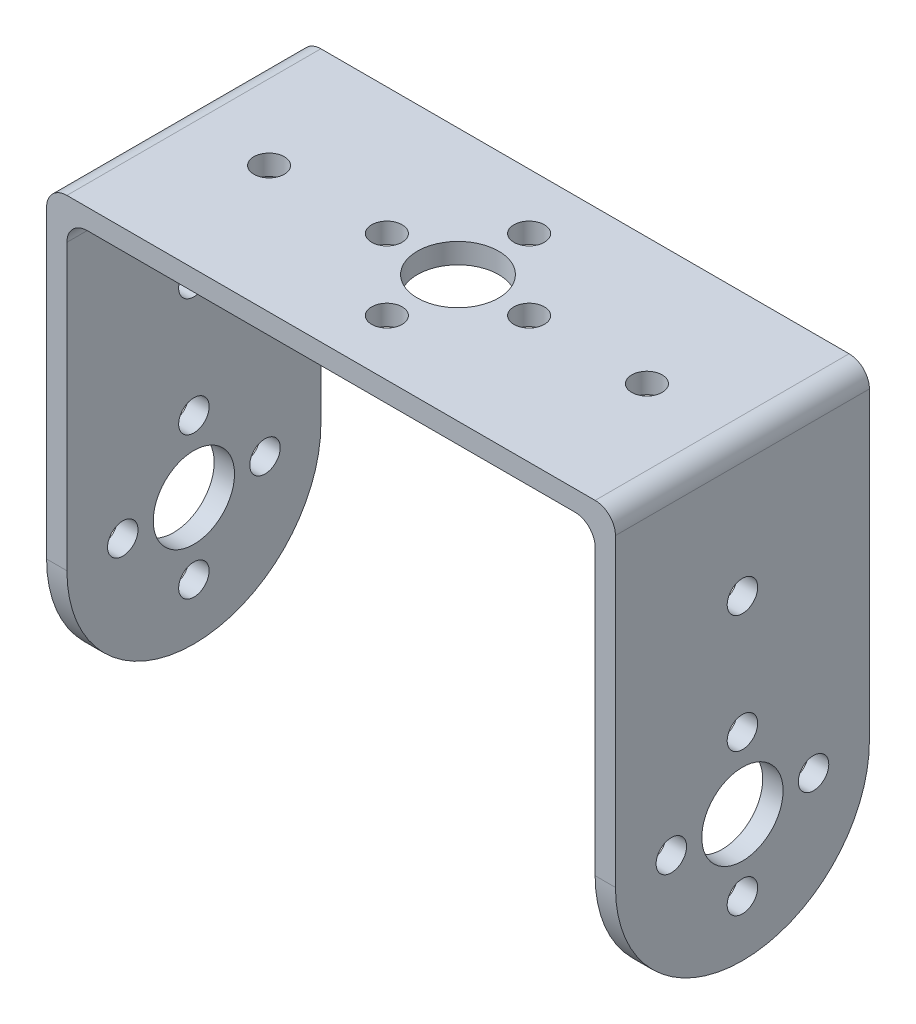
ISO-10303-21;
HEADER;
FILE_DESCRIPTION(('STEP AP214'),'2;1');
FILE_NAME('part.step','',(''),(''),'','','');
FILE_SCHEMA(('AUTOMOTIVE_DESIGN { 1 0 10303 214 1 1 1 1 }'));
ENDSEC;
DATA;
#1=APPLICATION_CONTEXT('core data for automotive mechanical design processes');
#2=APPLICATION_PROTOCOL_DEFINITION('international standard','automotive_design',2000,#1);
#3=PRODUCT_CONTEXT('',#1,'mechanical');
#4=PRODUCT('Part','Part','',(#3));
#5=PRODUCT_RELATED_PRODUCT_CATEGORY('part','',(#4));
#6=PRODUCT_DEFINITION_FORMATION('','',#4);
#7=PRODUCT_DEFINITION_CONTEXT('part definition',#1,'design');
#8=PRODUCT_DEFINITION('design','',#6,#7);
#9=PRODUCT_DEFINITION_SHAPE('','',#8);
#10=(LENGTH_UNIT() NAMED_UNIT(*) SI_UNIT(.MILLI.,.METRE.));
#11=(NAMED_UNIT(*) PLANE_ANGLE_UNIT() SI_UNIT($,.RADIAN.));
#12=(NAMED_UNIT(*) SI_UNIT($,.STERADIAN.) SOLID_ANGLE_UNIT());
#13=UNCERTAINTY_MEASURE_WITH_UNIT(LENGTH_MEASURE(1.E-05),#10,'distance_accuracy_value','');
#14=(GEOMETRIC_REPRESENTATION_CONTEXT(3) GLOBAL_UNCERTAINTY_ASSIGNED_CONTEXT((#13)) GLOBAL_UNIT_ASSIGNED_CONTEXT((#10,
#11,#12)) REPRESENTATION_CONTEXT('',''));
#15=CARTESIAN_POINT('',(0.,0.,0.));
#16=DIRECTION('',(0.,0.,1.));
#17=DIRECTION('',(1.,0.,0.));
#18=AXIS2_PLACEMENT_3D('',#15,#16,#17);
#19=CARTESIAN_POINT('',(0.,2.,0.));
#20=DIRECTION('',(0.,-1.,0.));
#21=DIRECTION('',(0.,0.,-1.));
#22=AXIS2_PLACEMENT_3D('',#19,#20,#21);
#23=PLANE('',#22);
#24=DIRECTION('',(-1.,0.,0.));
#25=VECTOR('',#24,1.);
#26=CARTESIAN_POINT('',(-52.,2.,-25.));
#27=LINE('',#26,#25);
#28=CARTESIAN_POINT('',(0.,2.,-25.));
#29=VERTEX_POINT('',#28);
#30=CARTESIAN_POINT('',(-52.,2.,-25.));
#31=VERTEX_POINT('',#30);
#32=EDGE_CURVE('E168',#29,#31,#27,.T.);
#33=ORIENTED_EDGE('',*,*,#32,.T.);
#34=DIRECTION('',(0.,0.,1.));
#35=VECTOR('',#34,1.);
#36=CARTESIAN_POINT('',(-52.,2.,0.));
#37=LINE('',#36,#35);
#38=CARTESIAN_POINT('',(-52.,2.,0.));
#39=VERTEX_POINT('',#38);
#40=EDGE_CURVE('E209',#31,#39,#37,.T.);
#41=ORIENTED_EDGE('',*,*,#40,.T.);
#42=DIRECTION('',(1.,0.,0.));
#43=VECTOR('',#42,1.);
#44=CARTESIAN_POINT('',(0.,2.,0.));
#45=LINE('',#44,#43);
#46=CARTESIAN_POINT('',(0.,2.,0.));
#47=VERTEX_POINT('',#46);
#48=EDGE_CURVE('E164',#39,#47,#45,.T.);
#49=ORIENTED_EDGE('',*,*,#48,.T.);
#50=DIRECTION('',(0.,0.,-1.));
#51=VECTOR('',#50,1.);
#52=CARTESIAN_POINT('',(0.,2.,-25.));
#53=LINE('',#52,#51);
#54=EDGE_CURVE('E206',#47,#29,#53,.T.);
#55=ORIENTED_EDGE('',*,*,#54,.T.);
#56=EDGE_LOOP('',(#33,#41,#49,#55));
#57=FACE_BOUND('',#56,.T.);
#58=CARTESIAN_POINT('',(-7.40000000000001,2.,-12.5));
#59=DIRECTION('',(0.,1.,0.));
#60=DIRECTION('',(0.,0.,1.));
#61=AXIS2_PLACEMENT_3D('',#58,#59,#60);
#62=CIRCLE('',#61,1.5);
#63=CARTESIAN_POINT('',(-7.40000000000001,2.,-11.));
#64=VERTEX_POINT('',#63);
#65=EDGE_CURVE('E291',#64,#64,#62,.T.);
#66=ORIENTED_EDGE('',*,*,#65,.F.);
#67=EDGE_LOOP('',(#66));
#68=FACE_BOUND('',#67,.T.);
#69=CARTESIAN_POINT('',(-26.,2.,-12.5));
#70=DIRECTION('',(0.,1.,0.));
#71=DIRECTION('',(0.,0.,1.));
#72=AXIS2_PLACEMENT_3D('',#69,#70,#71);
#73=CIRCLE('',#72,4.);
#74=CARTESIAN_POINT('',(-26.,2.,-8.5));
#75=VERTEX_POINT('',#74);
#76=EDGE_CURVE('E285',#75,#75,#73,.T.);
#77=ORIENTED_EDGE('',*,*,#76,.F.);
#78=EDGE_LOOP('',(#77));
#79=FACE_BOUND('',#78,.T.);
#80=CARTESIAN_POINT('',(-26.,2.,-5.5));
#81=DIRECTION('',(0.,1.,0.));
#82=DIRECTION('',(0.,0.,1.));
#83=AXIS2_PLACEMENT_3D('',#80,#81,#82);
#84=CIRCLE('',#83,1.5);
#85=CARTESIAN_POINT('',(-26.,2.,-4.));
#86=VERTEX_POINT('',#85);
#87=EDGE_CURVE('E279',#86,#86,#84,.T.);
#88=ORIENTED_EDGE('',*,*,#87,.F.);
#89=EDGE_LOOP('',(#88));
#90=FACE_BOUND('',#89,.T.);
#91=CARTESIAN_POINT('',(-44.6,2.,-12.5));
#92=DIRECTION('',(0.,1.,0.));
#93=DIRECTION('',(0.,0.,1.));
#94=AXIS2_PLACEMENT_3D('',#91,#92,#93);
#95=CIRCLE('',#94,1.5);
#96=CARTESIAN_POINT('',(-44.6,2.,-11.));
#97=VERTEX_POINT('',#96);
#98=EDGE_CURVE('E273',#97,#97,#95,.T.);
#99=ORIENTED_EDGE('',*,*,#98,.F.);
#100=EDGE_LOOP('',(#99));
#101=FACE_BOUND('',#100,.T.);
#102=CARTESIAN_POINT('',(-33.,2.,-12.5));
#103=DIRECTION('',(0.,1.,0.));
#104=DIRECTION('',(0.,0.,1.));
#105=AXIS2_PLACEMENT_3D('',#102,#103,#104);
#106=CIRCLE('',#105,1.5);
#107=CARTESIAN_POINT('',(-33.,2.,-11.));
#108=VERTEX_POINT('',#107);
#109=EDGE_CURVE('E267',#108,#108,#106,.T.);
#110=ORIENTED_EDGE('',*,*,#109,.F.);
#111=EDGE_LOOP('',(#110));
#112=FACE_BOUND('',#111,.T.);
#113=CARTESIAN_POINT('',(-25.9999999999999,2.,-19.5));
#114=DIRECTION('',(0.,1.,0.));
#115=DIRECTION('',(0.,0.,1.));
#116=AXIS2_PLACEMENT_3D('',#113,#114,#115);
#117=CIRCLE('',#116,1.5);
#118=CARTESIAN_POINT('',(-25.9999999999999,2.,-18.));
#119=VERTEX_POINT('',#118);
#120=EDGE_CURVE('E261',#119,#119,#117,.T.);
#121=ORIENTED_EDGE('',*,*,#120,.F.);
#122=EDGE_LOOP('',(#121));
#123=FACE_BOUND('',#122,.T.);
#124=CARTESIAN_POINT('',(-19.,2.,-12.4999999999999));
#125=DIRECTION('',(0.,1.,0.));
#126=DIRECTION('',(0.,0.,1.));
#127=AXIS2_PLACEMENT_3D('',#124,#125,#126);
#128=CIRCLE('',#127,1.5);
#129=CARTESIAN_POINT('',(-19.,2.,-10.9999999999999));
#130=VERTEX_POINT('',#129);
#131=EDGE_CURVE('E255',#130,#130,#128,.T.);
#132=ORIENTED_EDGE('',*,*,#131,.F.);
#133=EDGE_LOOP('',(#132));
#134=FACE_BOUND('',#133,.T.);
#135=ADVANCED_FACE('F35',(#57,#68,#79,#90,#101,#112,#123,#134),#23,.F.);
#136=CARTESIAN_POINT('',(0.,0.,0.));
#137=DIRECTION('',(0.,-1.,0.));
#138=DIRECTION('',(0.,0.,-1.));
#139=AXIS2_PLACEMENT_3D('',#136,#137,#138);
#140=PLANE('',#139);
#141=CARTESIAN_POINT('',(-25.9999999999999,0.,-19.5));
#142=DIRECTION('',(0.,1.,0.));
#143=DIRECTION('',(0.,0.,1.));
#144=AXIS2_PLACEMENT_3D('',#141,#142,#143);
#145=CIRCLE('',#144,1.5);
#146=CARTESIAN_POINT('',(-25.9999999999999,0.,-18.));
#147=VERTEX_POINT('',#146);
#148=EDGE_CURVE('E258',#147,#147,#145,.T.);
#149=ORIENTED_EDGE('',*,*,#148,.T.);
#150=EDGE_LOOP('',(#149));
#151=FACE_BOUND('',#150,.T.);
#152=CARTESIAN_POINT('',(-44.6,0.,-12.5));
#153=DIRECTION('',(0.,1.,0.));
#154=DIRECTION('',(0.,0.,1.));
#155=AXIS2_PLACEMENT_3D('',#152,#153,#154);
#156=CIRCLE('',#155,1.5);
#157=CARTESIAN_POINT('',(-44.6,0.,-11.));
#158=VERTEX_POINT('',#157);
#159=EDGE_CURVE('E270',#158,#158,#156,.T.);
#160=ORIENTED_EDGE('',*,*,#159,.T.);
#161=EDGE_LOOP('',(#160));
#162=FACE_BOUND('',#161,.T.);
#163=CARTESIAN_POINT('',(-26.,0.,-12.5));
#164=DIRECTION('',(0.,1.,0.));
#165=DIRECTION('',(0.,0.,1.));
#166=AXIS2_PLACEMENT_3D('',#163,#164,#165);
#167=CIRCLE('',#166,4.);
#168=CARTESIAN_POINT('',(-26.,0.,-8.5));
#169=VERTEX_POINT('',#168);
#170=EDGE_CURVE('E282',#169,#169,#167,.T.);
#171=ORIENTED_EDGE('',*,*,#170,.T.);
#172=EDGE_LOOP('',(#171));
#173=FACE_BOUND('',#172,.T.);
#174=DIRECTION('',(-1.,0.,0.));
#175=VECTOR('',#174,1.);
#176=CARTESIAN_POINT('',(-52.,0.,-25.));
#177=LINE('',#176,#175);
#178=CARTESIAN_POINT('',(-2.00000000000002,0.,-25.));
#179=VERTEX_POINT('',#178);
#180=CARTESIAN_POINT('',(-50.,0.,-25.));
#181=VERTEX_POINT('',#180);
#182=EDGE_CURVE('E240',#179,#181,#177,.T.);
#183=ORIENTED_EDGE('',*,*,#182,.F.);
#184=DIRECTION('',(0.,0.,-1.));
#185=VECTOR('',#184,1.);
#186=CARTESIAN_POINT('',(-2.,0.,0.));
#187=LINE('',#186,#185);
#188=CARTESIAN_POINT('',(-2.,0.,0.));
#189=VERTEX_POINT('',#188);
#190=EDGE_CURVE('E202',#179,#189,#187,.F.);
#191=ORIENTED_EDGE('',*,*,#190,.T.);
#192=DIRECTION('',(1.,0.,0.));
#193=VECTOR('',#192,1.);
#194=CARTESIAN_POINT('',(0.,0.,0.));
#195=LINE('',#194,#193);
#196=CARTESIAN_POINT('',(-50.,0.,0.));
#197=VERTEX_POINT('',#196);
#198=EDGE_CURVE('E171',#197,#189,#195,.T.);
#199=ORIENTED_EDGE('',*,*,#198,.F.);
#200=DIRECTION('',(0.,0.,1.));
#201=VECTOR('',#200,1.);
#202=CARTESIAN_POINT('',(-50.,0.,-25.));
#203=LINE('',#202,#201);
#204=EDGE_CURVE('E200',#197,#181,#203,.F.);
#205=ORIENTED_EDGE('',*,*,#204,.T.);
#206=EDGE_LOOP('',(#183,#191,#199,#205));
#207=FACE_BOUND('',#206,.T.);
#208=CARTESIAN_POINT('',(-7.40000000000001,0.,-12.5));
#209=DIRECTION('',(0.,1.,0.));
#210=DIRECTION('',(0.,0.,1.));
#211=AXIS2_PLACEMENT_3D('',#208,#209,#210);
#212=CIRCLE('',#211,1.5);
#213=CARTESIAN_POINT('',(-7.40000000000001,0.,-11.));
#214=VERTEX_POINT('',#213);
#215=EDGE_CURVE('E288',#214,#214,#212,.T.);
#216=ORIENTED_EDGE('',*,*,#215,.T.);
#217=EDGE_LOOP('',(#216));
#218=FACE_BOUND('',#217,.T.);
#219=CARTESIAN_POINT('',(-26.,0.,-5.5));
#220=DIRECTION('',(0.,1.,0.));
#221=DIRECTION('',(0.,0.,1.));
#222=AXIS2_PLACEMENT_3D('',#219,#220,#221);
#223=CIRCLE('',#222,1.5);
#224=CARTESIAN_POINT('',(-26.,0.,-4.));
#225=VERTEX_POINT('',#224);
#226=EDGE_CURVE('E276',#225,#225,#223,.T.);
#227=ORIENTED_EDGE('',*,*,#226,.T.);
#228=EDGE_LOOP('',(#227));
#229=FACE_BOUND('',#228,.T.);
#230=CARTESIAN_POINT('',(-33.,0.,-12.5));
#231=DIRECTION('',(0.,1.,0.));
#232=DIRECTION('',(0.,0.,1.));
#233=AXIS2_PLACEMENT_3D('',#230,#231,#232);
#234=CIRCLE('',#233,1.5);
#235=CARTESIAN_POINT('',(-33.,0.,-11.));
#236=VERTEX_POINT('',#235);
#237=EDGE_CURVE('E264',#236,#236,#234,.T.);
#238=ORIENTED_EDGE('',*,*,#237,.T.);
#239=EDGE_LOOP('',(#238));
#240=FACE_BOUND('',#239,.T.);
#241=CARTESIAN_POINT('',(-19.,0.,-12.4999999999999));
#242=DIRECTION('',(0.,1.,0.));
#243=DIRECTION('',(0.,0.,1.));
#244=AXIS2_PLACEMENT_3D('',#241,#242,#243);
#245=CIRCLE('',#244,1.5);
#246=CARTESIAN_POINT('',(-19.,0.,-10.9999999999999));
#247=VERTEX_POINT('',#246);
#248=EDGE_CURVE('E242',#247,#247,#245,.T.);
#249=ORIENTED_EDGE('',*,*,#248,.T.);
#250=EDGE_LOOP('',(#249));
#251=FACE_BOUND('',#250,.T.);
#252=ADVANCED_FACE('F237',(#151,#162,#173,#207,#218,#229,#240,#251),#140,.T.);
#253=CARTESIAN_POINT('',(-52.,2.,-25.));
#254=DIRECTION('',(0.,0.,1.));
#255=DIRECTION('',(1.,0.,0.));
#256=AXIS2_PLACEMENT_3D('',#253,#254,#255);
#257=PLANE('',#256);
#258=DIRECTION('',(0.,1.,0.));
#259=VECTOR('',#258,1.);
#260=CARTESIAN_POINT('',(-54.,-42.5,-25.));
#261=LINE('',#260,#259);
#262=CARTESIAN_POINT('',(-54.,-30.,-25.));
#263=VERTEX_POINT('',#262);
#264=CARTESIAN_POINT('',(-54.,0.,-25.));
#265=VERTEX_POINT('',#264);
#266=EDGE_CURVE('E158',#263,#265,#261,.T.);
#267=ORIENTED_EDGE('',*,*,#266,.T.);
#268=CARTESIAN_POINT('',(-52.,0.,-25.));
#269=DIRECTION('',(0.,0.,1.));
#270=DIRECTION('',(1.,0.,0.));
#271=AXIS2_PLACEMENT_3D('',#268,#269,#270);
#272=CIRCLE('',#271,2.);
#273=EDGE_CURVE('E218',#265,#31,#272,.F.);
#274=ORIENTED_EDGE('',*,*,#273,.T.);
#275=ORIENTED_EDGE('',*,*,#32,.F.);
#276=CARTESIAN_POINT('',(0.,0.,-25.));
#277=DIRECTION('',(0.,0.,1.));
#278=DIRECTION('',(1.,0.,0.));
#279=AXIS2_PLACEMENT_3D('',#276,#277,#278);
#280=CIRCLE('',#279,2.);
#281=CARTESIAN_POINT('',(2.,0.,-25.));
#282=VERTEX_POINT('',#281);
#283=EDGE_CURVE('E50',#29,#282,#280,.F.);
#284=ORIENTED_EDGE('',*,*,#283,.T.);
#285=DIRECTION('',(0.,1.,0.));
#286=VECTOR('',#285,1.);
#287=CARTESIAN_POINT('',(2.,-42.5,-25.));
#288=LINE('',#287,#286);
#289=CARTESIAN_POINT('',(2.,-30.,-25.));
#290=VERTEX_POINT('',#289);
#291=EDGE_CURVE('E310',#290,#282,#288,.T.);
#292=ORIENTED_EDGE('',*,*,#291,.F.);
#293=DIRECTION('',(-1.,0.,0.));
#294=VECTOR('',#293,1.);
#295=CARTESIAN_POINT('',(-52.,-30.,-25.));
#296=LINE('',#295,#294);
#297=CARTESIAN_POINT('',(0.,-30.,-25.));
#298=VERTEX_POINT('',#297);
#299=EDGE_CURVE('E177',#290,#298,#296,.T.);
#300=ORIENTED_EDGE('',*,*,#299,.T.);
#301=DIRECTION('',(0.,1.,0.));
#302=VECTOR('',#301,1.);
#303=CARTESIAN_POINT('',(0.,-42.5,-25.));
#304=LINE('',#303,#302);
#305=CARTESIAN_POINT('',(0.,-2.,-25.));
#306=VERTEX_POINT('',#305);
#307=EDGE_CURVE('E159',#298,#306,#304,.T.);
#308=ORIENTED_EDGE('',*,*,#307,.T.);
#309=CARTESIAN_POINT('',(-2.,-2.,-25.));
#310=DIRECTION('',(0.,0.,1.));
#311=DIRECTION('',(1.,0.,0.));
#312=AXIS2_PLACEMENT_3D('',#309,#310,#311);
#313=CIRCLE('',#312,2.);
#314=EDGE_CURVE('E222',#306,#179,#313,.T.);
#315=ORIENTED_EDGE('',*,*,#314,.T.);
#316=ORIENTED_EDGE('',*,*,#182,.T.);
#317=CARTESIAN_POINT('',(-50.,-2.,-25.));
#318=DIRECTION('',(0.,0.,1.));
#319=DIRECTION('',(1.,0.,0.));
#320=AXIS2_PLACEMENT_3D('',#317,#318,#319);
#321=CIRCLE('',#320,2.);
#322=CARTESIAN_POINT('',(-52.,-2.,-25.));
#323=VERTEX_POINT('',#322);
#324=EDGE_CURVE('E11',#181,#323,#321,.T.);
#325=ORIENTED_EDGE('',*,*,#324,.T.);
#326=DIRECTION('',(0.,1.,0.));
#327=VECTOR('',#326,1.);
#328=CARTESIAN_POINT('',(-52.,-42.5,-25.));
#329=LINE('',#328,#327);
#330=CARTESIAN_POINT('',(-52.,-30.,-25.));
#331=VERTEX_POINT('',#330);
#332=EDGE_CURVE('E142',#331,#323,#329,.T.);
#333=ORIENTED_EDGE('',*,*,#332,.F.);
#334=DIRECTION('',(-1.,0.,0.));
#335=VECTOR('',#334,1.);
#336=CARTESIAN_POINT('',(-54.,-30.,-25.));
#337=LINE('',#336,#335);
#338=EDGE_CURVE('E155',#331,#263,#337,.T.);
#339=ORIENTED_EDGE('',*,*,#338,.T.);
#340=EDGE_LOOP('',(#267,#274,#275,#284,#292,#300,#308,#315,#316,#325,#333,#339));
#341=FACE_BOUND('',#340,.T.);
#342=ADVANCED_FACE('F154',(#341),#257,.F.);
#343=CARTESIAN_POINT('',(0.,2.,0.));
#344=DIRECTION('',(0.,0.,-1.));
#345=DIRECTION('',(-1.,0.,0.));
#346=AXIS2_PLACEMENT_3D('',#343,#344,#345);
#347=PLANE('',#346);
#348=ORIENTED_EDGE('',*,*,#48,.F.);
#349=CARTESIAN_POINT('',(-52.,0.,0.));
#350=DIRECTION('',(0.,0.,-1.));
#351=DIRECTION('',(-1.,0.,0.));
#352=AXIS2_PLACEMENT_3D('',#349,#350,#351);
#353=CIRCLE('',#352,2.);
#354=CARTESIAN_POINT('',(-54.,0.,0.));
#355=VERTEX_POINT('',#354);
#356=EDGE_CURVE('E214',#39,#355,#353,.F.);
#357=ORIENTED_EDGE('',*,*,#356,.T.);
#358=DIRECTION('',(0.,1.,0.));
#359=VECTOR('',#358,1.);
#360=CARTESIAN_POINT('',(-54.,-42.5,0.));
#361=LINE('',#360,#359);
#362=CARTESIAN_POINT('',(-54.,-30.,0.));
#363=VERTEX_POINT('',#362);
#364=EDGE_CURVE('E243',#363,#355,#361,.T.);
#365=ORIENTED_EDGE('',*,*,#364,.F.);
#366=DIRECTION('',(1.,0.,0.));
#367=VECTOR('',#366,1.);
#368=CARTESIAN_POINT('',(-52.,-30.,0.));
#369=LINE('',#368,#367);
#370=CARTESIAN_POINT('',(-52.,-30.,0.));
#371=VERTEX_POINT('',#370);
#372=EDGE_CURVE('E151',#363,#371,#369,.T.);
#373=ORIENTED_EDGE('',*,*,#372,.T.);
#374=DIRECTION('',(0.,1.,0.));
#375=VECTOR('',#374,1.);
#376=CARTESIAN_POINT('',(-52.,-42.5,0.));
#377=LINE('',#376,#375);
#378=CARTESIAN_POINT('',(-52.,-2.,0.));
#379=VERTEX_POINT('',#378);
#380=EDGE_CURVE('E232',#371,#379,#377,.T.);
#381=ORIENTED_EDGE('',*,*,#380,.T.);
#382=CARTESIAN_POINT('',(-50.,-2.,0.));
#383=DIRECTION('',(0.,0.,-1.));
#384=DIRECTION('',(-1.,0.,0.));
#385=AXIS2_PLACEMENT_3D('',#382,#383,#384);
#386=CIRCLE('',#385,2.);
#387=EDGE_CURVE('E43',#379,#197,#386,.T.);
#388=ORIENTED_EDGE('',*,*,#387,.T.);
#389=ORIENTED_EDGE('',*,*,#198,.T.);
#390=CARTESIAN_POINT('',(-2.,-2.,0.));
#391=DIRECTION('',(0.,0.,-1.));
#392=DIRECTION('',(-1.,0.,0.));
#393=AXIS2_PLACEMENT_3D('',#390,#391,#392);
#394=CIRCLE('',#393,2.);
#395=CARTESIAN_POINT('',(0.,-2.,0.));
#396=VERTEX_POINT('',#395);
#397=EDGE_CURVE('E224',#189,#396,#394,.T.);
#398=ORIENTED_EDGE('',*,*,#397,.T.);
#399=DIRECTION('',(0.,1.,0.));
#400=VECTOR('',#399,1.);
#401=CARTESIAN_POINT('',(0.,-42.5,0.));
#402=LINE('',#401,#400);
#403=CARTESIAN_POINT('',(0.,-30.,0.));
#404=VERTEX_POINT('',#403);
#405=EDGE_CURVE('E180',#404,#396,#402,.T.);
#406=ORIENTED_EDGE('',*,*,#405,.F.);
#407=DIRECTION('',(1.,0.,0.));
#408=VECTOR('',#407,1.);
#409=CARTESIAN_POINT('',(0.,-30.,0.));
#410=LINE('',#409,#408);
#411=CARTESIAN_POINT('',(2.,-30.,0.));
#412=VERTEX_POINT('',#411);
#413=EDGE_CURVE('E192',#404,#412,#410,.T.);
#414=ORIENTED_EDGE('',*,*,#413,.T.);
#415=DIRECTION('',(0.,1.,0.));
#416=VECTOR('',#415,1.);
#417=CARTESIAN_POINT('',(2.,-42.5,0.));
#418=LINE('',#417,#416);
#419=CARTESIAN_POINT('',(2.,0.,0.));
#420=VERTEX_POINT('',#419);
#421=EDGE_CURVE('E308',#412,#420,#418,.T.);
#422=ORIENTED_EDGE('',*,*,#421,.T.);
#423=CARTESIAN_POINT('',(0.,0.,0.));
#424=DIRECTION('',(0.,0.,-1.));
#425=DIRECTION('',(-1.,0.,0.));
#426=AXIS2_PLACEMENT_3D('',#423,#424,#425);
#427=CIRCLE('',#426,2.);
#428=EDGE_CURVE('E212',#420,#47,#427,.F.);
#429=ORIENTED_EDGE('',*,*,#428,.T.);
#430=EDGE_LOOP('',(#348,#357,#365,#373,#381,#388,#389,#398,#406,#414,#422,#429));
#431=FACE_BOUND('',#430,.T.);
#432=ADVANCED_FACE('F230',(#431),#347,.F.);
#433=CARTESIAN_POINT('',(-7.40000000000001,2.,-12.5));
#434=DIRECTION('',(0.,-1.,0.));
#435=DIRECTION('',(0.,0.,-1.));
#436=AXIS2_PLACEMENT_3D('',#433,#434,#435);
#437=CYLINDRICAL_SURFACE('',#436,1.5);
#438=ORIENTED_EDGE('',*,*,#65,.T.);
#439=EDGE_LOOP('',(#438));
#440=FACE_BOUND('',#439,.T.);
#441=ORIENTED_EDGE('',*,*,#215,.F.);
#442=EDGE_LOOP('',(#441));
#443=FACE_BOUND('',#442,.T.);
#444=ADVANCED_FACE('F423',(#440,#443),#437,.F.);
#445=CARTESIAN_POINT('',(-26.,2.,-12.5));
#446=DIRECTION('',(0.,-1.,0.));
#447=DIRECTION('',(0.,0.,-1.));
#448=AXIS2_PLACEMENT_3D('',#445,#446,#447);
#449=CYLINDRICAL_SURFACE('',#448,4.);
#450=ORIENTED_EDGE('',*,*,#76,.T.);
#451=EDGE_LOOP('',(#450));
#452=FACE_BOUND('',#451,.T.);
#453=ORIENTED_EDGE('',*,*,#170,.F.);
#454=EDGE_LOOP('',(#453));
#455=FACE_BOUND('',#454,.T.);
#456=ADVANCED_FACE('F545',(#452,#455),#449,.F.);
#457=CARTESIAN_POINT('',(-26.,2.,-5.5));
#458=DIRECTION('',(0.,-1.,0.));
#459=DIRECTION('',(0.,0.,-1.));
#460=AXIS2_PLACEMENT_3D('',#457,#458,#459);
#461=CYLINDRICAL_SURFACE('',#460,1.5);
#462=ORIENTED_EDGE('',*,*,#87,.T.);
#463=EDGE_LOOP('',(#462));
#464=FACE_BOUND('',#463,.T.);
#465=ORIENTED_EDGE('',*,*,#226,.F.);
#466=EDGE_LOOP('',(#465));
#467=FACE_BOUND('',#466,.T.);
#468=ADVANCED_FACE('F542',(#464,#467),#461,.F.);
#469=CARTESIAN_POINT('',(-44.6,2.,-12.5));
#470=DIRECTION('',(0.,-1.,0.));
#471=DIRECTION('',(0.,0.,-1.));
#472=AXIS2_PLACEMENT_3D('',#469,#470,#471);
#473=CYLINDRICAL_SURFACE('',#472,1.5);
#474=ORIENTED_EDGE('',*,*,#98,.T.);
#475=EDGE_LOOP('',(#474));
#476=FACE_BOUND('',#475,.T.);
#477=ORIENTED_EDGE('',*,*,#159,.F.);
#478=EDGE_LOOP('',(#477));
#479=FACE_BOUND('',#478,.T.);
#480=ADVANCED_FACE('F538',(#476,#479),#473,.F.);
#481=CARTESIAN_POINT('',(-33.,2.,-12.5));
#482=DIRECTION('',(0.,-1.,0.));
#483=DIRECTION('',(0.,0.,-1.));
#484=AXIS2_PLACEMENT_3D('',#481,#482,#483);
#485=CYLINDRICAL_SURFACE('',#484,1.5);
#486=ORIENTED_EDGE('',*,*,#109,.T.);
#487=EDGE_LOOP('',(#486));
#488=FACE_BOUND('',#487,.T.);
#489=ORIENTED_EDGE('',*,*,#237,.F.);
#490=EDGE_LOOP('',(#489));
#491=FACE_BOUND('',#490,.T.);
#492=ADVANCED_FACE('F534',(#488,#491),#485,.F.);
#493=CARTESIAN_POINT('',(-25.9999999999999,2.,-19.5));
#494=DIRECTION('',(0.,-1.,0.));
#495=DIRECTION('',(0.,0.,-1.));
#496=AXIS2_PLACEMENT_3D('',#493,#494,#495);
#497=CYLINDRICAL_SURFACE('',#496,1.5);
#498=ORIENTED_EDGE('',*,*,#120,.T.);
#499=EDGE_LOOP('',(#498));
#500=FACE_BOUND('',#499,.T.);
#501=ORIENTED_EDGE('',*,*,#148,.F.);
#502=EDGE_LOOP('',(#501));
#503=FACE_BOUND('',#502,.T.);
#504=ADVANCED_FACE('F530',(#500,#503),#497,.F.);
#505=CARTESIAN_POINT('',(-19.,2.,-12.4999999999999));
#506=DIRECTION('',(0.,-1.,0.));
#507=DIRECTION('',(0.,0.,-1.));
#508=AXIS2_PLACEMENT_3D('',#505,#506,#507);
#509=CYLINDRICAL_SURFACE('',#508,1.5);
#510=ORIENTED_EDGE('',*,*,#131,.T.);
#511=EDGE_LOOP('',(#510));
#512=FACE_BOUND('',#511,.T.);
#513=ORIENTED_EDGE('',*,*,#248,.F.);
#514=EDGE_LOOP('',(#513));
#515=FACE_BOUND('',#514,.T.);
#516=ADVANCED_FACE('F522',(#512,#515),#509,.F.);
#517=CARTESIAN_POINT('',(-52.,-42.5,-25.));
#518=DIRECTION('',(1.,0.,0.));
#519=DIRECTION('',(0.,0.,-1.));
#520=AXIS2_PLACEMENT_3D('',#517,#518,#519);
#521=PLANE('',#520);
#522=CARTESIAN_POINT('',(-52.,-30.,-5.5000000000001));
#523=DIRECTION('',(1.,0.,0.));
#524=DIRECTION('',(0.,0.,-1.));
#525=AXIS2_PLACEMENT_3D('',#522,#523,#524);
#526=CIRCLE('',#525,1.5);
#527=CARTESIAN_POINT('',(-52.,-30.,-7.0000000000001));
#528=VERTEX_POINT('',#527);
#529=EDGE_CURVE('E197',#528,#528,#526,.T.);
#530=ORIENTED_EDGE('',*,*,#529,.F.);
#531=EDGE_LOOP('',(#530));
#532=FACE_BOUND('',#531,.T.);
#533=CARTESIAN_POINT('',(-52.,-37.,-12.5000000000001));
#534=DIRECTION('',(1.,0.,0.));
#535=DIRECTION('',(0.,0.,-1.));
#536=AXIS2_PLACEMENT_3D('',#533,#534,#535);
#537=CIRCLE('',#536,1.5);
#538=CARTESIAN_POINT('',(-52.,-37.,-14.0000000000001));
#539=VERTEX_POINT('',#538);
#540=EDGE_CURVE('E323',#539,#539,#537,.T.);
#541=ORIENTED_EDGE('',*,*,#540,.F.);
#542=EDGE_LOOP('',(#541));
#543=FACE_BOUND('',#542,.T.);
#544=CARTESIAN_POINT('',(-52.,-29.9999999999999,-19.5000000000001));
#545=DIRECTION('',(1.,0.,0.));
#546=DIRECTION('',(0.,0.,-1.));
#547=AXIS2_PLACEMENT_3D('',#544,#545,#546);
#548=CIRCLE('',#547,1.5);
#549=CARTESIAN_POINT('',(-52.,-29.9999999999999,-21.0000000000001));
#550=VERTEX_POINT('',#549);
#551=EDGE_CURVE('E332',#550,#550,#548,.T.);
#552=ORIENTED_EDGE('',*,*,#551,.F.);
#553=EDGE_LOOP('',(#552));
#554=FACE_BOUND('',#553,.T.);
#555=CARTESIAN_POINT('',(-52.,-11.4,-12.5));
#556=DIRECTION('',(1.,0.,0.));
#557=DIRECTION('',(0.,0.,-1.));
#558=AXIS2_PLACEMENT_3D('',#555,#556,#557);
#559=CIRCLE('',#558,1.5);
#560=CARTESIAN_POINT('',(-52.,-11.4,-14.));
#561=VERTEX_POINT('',#560);
#562=EDGE_CURVE('E341',#561,#561,#559,.T.);
#563=ORIENTED_EDGE('',*,*,#562,.F.);
#564=EDGE_LOOP('',(#563));
#565=FACE_BOUND('',#564,.T.);
#566=CARTESIAN_POINT('',(-52.,-23.,-12.5));
#567=DIRECTION('',(1.,0.,0.));
#568=DIRECTION('',(0.,0.,-1.));
#569=AXIS2_PLACEMENT_3D('',#566,#567,#568);
#570=CIRCLE('',#569,1.5);
#571=CARTESIAN_POINT('',(-52.,-23.,-14.));
#572=VERTEX_POINT('',#571);
#573=EDGE_CURVE('E350',#572,#572,#570,.T.);
#574=ORIENTED_EDGE('',*,*,#573,.F.);
#575=EDGE_LOOP('',(#574));
#576=FACE_BOUND('',#575,.T.);
#577=CARTESIAN_POINT('',(-52.,-30.,-12.5));
#578=DIRECTION('',(1.,0.,0.));
#579=DIRECTION('',(0.,0.,-1.));
#580=AXIS2_PLACEMENT_3D('',#577,#578,#579);
#581=CIRCLE('',#580,4.);
#582=CARTESIAN_POINT('',(-52.,-30.,-16.5));
#583=VERTEX_POINT('',#582);
#584=EDGE_CURVE('E359',#583,#583,#581,.T.);
#585=ORIENTED_EDGE('',*,*,#584,.F.);
#586=EDGE_LOOP('',(#585));
#587=FACE_BOUND('',#586,.T.);
#588=ORIENTED_EDGE('',*,*,#332,.T.);
#589=DIRECTION('',(0.,0.,1.));
#590=VECTOR('',#589,1.);
#591=CARTESIAN_POINT('',(-52.,-2.,0.));
#592=LINE('',#591,#590);
#593=EDGE_CURVE('E204',#323,#379,#592,.T.);
#594=ORIENTED_EDGE('',*,*,#593,.T.);
#595=ORIENTED_EDGE('',*,*,#380,.F.);
#596=CARTESIAN_POINT('',(-52.,-30.,-12.5));
#597=DIRECTION('',(1.,0.,0.));
#598=DIRECTION('',(0.,0.,-1.));
#599=AXIS2_PLACEMENT_3D('',#596,#597,#598);
#600=CIRCLE('',#599,12.5);
#601=CARTESIAN_POINT('',(-52.,-42.5,-12.5));
#602=VERTEX_POINT('',#601);
#603=EDGE_CURVE('E146',#371,#602,#600,.T.);
#604=ORIENTED_EDGE('',*,*,#603,.T.);
#605=CARTESIAN_POINT('',(-52.,-30.,-12.5));
#606=DIRECTION('',(1.,0.,0.));
#607=DIRECTION('',(0.,0.,-1.));
#608=AXIS2_PLACEMENT_3D('',#605,#606,#607);
#609=CIRCLE('',#608,12.5);
#610=EDGE_CURVE('E138',#602,#331,#609,.T.);
#611=ORIENTED_EDGE('',*,*,#610,.T.);
#612=EDGE_LOOP('',(#588,#594,#595,#604,#611));
#613=FACE_BOUND('',#612,.T.);
#614=ADVANCED_FACE('F140',(#532,#543,#554,#565,#576,#587,#613),#521,.T.);
#615=CARTESIAN_POINT('',(-54.,-42.5,0.));
#616=DIRECTION('',(-1.,0.,0.));
#617=DIRECTION('',(0.,0.,1.));
#618=AXIS2_PLACEMENT_3D('',#615,#616,#617);
#619=PLANE('',#618);
#620=CARTESIAN_POINT('',(-54.,-30.,-5.5000000000001));
#621=DIRECTION('',(-1.,0.,0.));
#622=DIRECTION('',(0.,0.,1.));
#623=AXIS2_PLACEMENT_3D('',#620,#621,#622);
#624=CIRCLE('',#623,1.5);
#625=CARTESIAN_POINT('',(-54.,-30.,-4.0000000000001));
#626=VERTEX_POINT('',#625);
#627=EDGE_CURVE('E317',#626,#626,#624,.T.);
#628=ORIENTED_EDGE('',*,*,#627,.F.);
#629=EDGE_LOOP('',(#628));
#630=FACE_BOUND('',#629,.T.);
#631=CARTESIAN_POINT('',(-54.,-37.,-12.5000000000001));
#632=DIRECTION('',(-1.,0.,0.));
#633=DIRECTION('',(0.,0.,1.));
#634=AXIS2_PLACEMENT_3D('',#631,#632,#633);
#635=CIRCLE('',#634,1.5);
#636=CARTESIAN_POINT('',(-54.,-37.,-11.0000000000001));
#637=VERTEX_POINT('',#636);
#638=EDGE_CURVE('E326',#637,#637,#635,.T.);
#639=ORIENTED_EDGE('',*,*,#638,.F.);
#640=EDGE_LOOP('',(#639));
#641=FACE_BOUND('',#640,.T.);
#642=CARTESIAN_POINT('',(-54.,-29.9999999999999,-19.5000000000001));
#643=DIRECTION('',(-1.,0.,0.));
#644=DIRECTION('',(0.,0.,1.));
#645=AXIS2_PLACEMENT_3D('',#642,#643,#644);
#646=CIRCLE('',#645,1.5);
#647=CARTESIAN_POINT('',(-54.,-29.9999999999999,-18.0000000000001));
#648=VERTEX_POINT('',#647);
#649=EDGE_CURVE('E335',#648,#648,#646,.T.);
#650=ORIENTED_EDGE('',*,*,#649,.F.);
#651=EDGE_LOOP('',(#650));
#652=FACE_BOUND('',#651,.T.);
#653=CARTESIAN_POINT('',(-54.,-11.4,-12.5));
#654=DIRECTION('',(-1.,0.,0.));
#655=DIRECTION('',(0.,0.,1.));
#656=AXIS2_PLACEMENT_3D('',#653,#654,#655);
#657=CIRCLE('',#656,1.5);
#658=CARTESIAN_POINT('',(-54.,-11.4,-11.));
#659=VERTEX_POINT('',#658);
#660=EDGE_CURVE('E344',#659,#659,#657,.T.);
#661=ORIENTED_EDGE('',*,*,#660,.F.);
#662=EDGE_LOOP('',(#661));
#663=FACE_BOUND('',#662,.T.);
#664=CARTESIAN_POINT('',(-54.,-23.,-12.5));
#665=DIRECTION('',(-1.,0.,0.));
#666=DIRECTION('',(0.,0.,1.));
#667=AXIS2_PLACEMENT_3D('',#664,#665,#666);
#668=CIRCLE('',#667,1.5);
#669=CARTESIAN_POINT('',(-54.,-23.,-11.));
#670=VERTEX_POINT('',#669);
#671=EDGE_CURVE('E353',#670,#670,#668,.T.);
#672=ORIENTED_EDGE('',*,*,#671,.F.);
#673=EDGE_LOOP('',(#672));
#674=FACE_BOUND('',#673,.T.);
#675=CARTESIAN_POINT('',(-54.,-30.,-12.5));
#676=DIRECTION('',(-1.,0.,0.));
#677=DIRECTION('',(0.,0.,1.));
#678=AXIS2_PLACEMENT_3D('',#675,#676,#677);
#679=CIRCLE('',#678,4.);
#680=CARTESIAN_POINT('',(-54.,-30.,-8.49999999999999));
#681=VERTEX_POINT('',#680);
#682=EDGE_CURVE('E362',#681,#681,#679,.T.);
#683=ORIENTED_EDGE('',*,*,#682,.F.);
#684=EDGE_LOOP('',(#683));
#685=FACE_BOUND('',#684,.T.);
#686=ORIENTED_EDGE('',*,*,#364,.T.);
#687=DIRECTION('',(0.,0.,1.));
#688=VECTOR('',#687,1.);
#689=CARTESIAN_POINT('',(-54.,0.,-25.));
#690=LINE('',#689,#688);
#691=EDGE_CURVE('E58',#355,#265,#690,.F.);
#692=ORIENTED_EDGE('',*,*,#691,.T.);
#693=ORIENTED_EDGE('',*,*,#266,.F.);
#694=CARTESIAN_POINT('',(-54.,-30.,-12.5));
#695=DIRECTION('',(-1.,0.,0.));
#696=DIRECTION('',(0.,0.,1.));
#697=AXIS2_PLACEMENT_3D('',#694,#695,#696);
#698=CIRCLE('',#697,12.5);
#699=CARTESIAN_POINT('',(-54.,-42.5,-12.5));
#700=VERTEX_POINT('',#699);
#701=EDGE_CURVE('E162',#263,#700,#698,.T.);
#702=ORIENTED_EDGE('',*,*,#701,.T.);
#703=CARTESIAN_POINT('',(-54.,-30.,-12.5));
#704=DIRECTION('',(-1.,0.,0.));
#705=DIRECTION('',(0.,0.,1.));
#706=AXIS2_PLACEMENT_3D('',#703,#704,#705);
#707=CIRCLE('',#706,12.5);
#708=EDGE_CURVE('E163',#700,#363,#707,.T.);
#709=ORIENTED_EDGE('',*,*,#708,.T.);
#710=EDGE_LOOP('',(#686,#692,#693,#702,#709));
#711=FACE_BOUND('',#710,.T.);
#712=ADVANCED_FACE('F250',(#630,#641,#652,#663,#674,#685,#711),#619,.T.);
#713=CARTESIAN_POINT('',(0.,-42.5,-25.));
#714=DIRECTION('',(-1.,0.,0.));
#715=DIRECTION('',(0.,0.,1.));
#716=AXIS2_PLACEMENT_3D('',#713,#714,#715);
#717=PLANE('',#716);
#718=CARTESIAN_POINT('',(0.,-30.,-5.5000000000001));
#719=DIRECTION('',(-1.,0.,0.));
#720=DIRECTION('',(0.,0.,1.));
#721=AXIS2_PLACEMENT_3D('',#718,#719,#720);
#722=CIRCLE('',#721,1.5);
#723=CARTESIAN_POINT('',(0.,-30.,-4.0000000000001));
#724=VERTEX_POINT('',#723);
#725=EDGE_CURVE('E320',#724,#724,#722,.T.);
#726=ORIENTED_EDGE('',*,*,#725,.F.);
#727=EDGE_LOOP('',(#726));
#728=FACE_BOUND('',#727,.T.);
#729=CARTESIAN_POINT('',(0.,-37.,-12.5000000000001));
#730=DIRECTION('',(-1.,0.,0.));
#731=DIRECTION('',(0.,0.,1.));
#732=AXIS2_PLACEMENT_3D('',#729,#730,#731);
#733=CIRCLE('',#732,1.5);
#734=CARTESIAN_POINT('',(0.,-37.,-11.0000000000001));
#735=VERTEX_POINT('',#734);
#736=EDGE_CURVE('E329',#735,#735,#733,.T.);
#737=ORIENTED_EDGE('',*,*,#736,.F.);
#738=EDGE_LOOP('',(#737));
#739=FACE_BOUND('',#738,.T.);
#740=CARTESIAN_POINT('',(0.,-29.9999999999999,-19.5000000000001));
#741=DIRECTION('',(-1.,0.,0.));
#742=DIRECTION('',(0.,0.,1.));
#743=AXIS2_PLACEMENT_3D('',#740,#741,#742);
#744=CIRCLE('',#743,1.5);
#745=CARTESIAN_POINT('',(0.,-29.9999999999999,-18.0000000000001));
#746=VERTEX_POINT('',#745);
#747=EDGE_CURVE('E338',#746,#746,#744,.T.);
#748=ORIENTED_EDGE('',*,*,#747,.F.);
#749=EDGE_LOOP('',(#748));
#750=FACE_BOUND('',#749,.T.);
#751=CARTESIAN_POINT('',(0.,-11.4,-12.5));
#752=DIRECTION('',(-1.,0.,0.));
#753=DIRECTION('',(0.,0.,1.));
#754=AXIS2_PLACEMENT_3D('',#751,#752,#753);
#755=CIRCLE('',#754,1.5);
#756=CARTESIAN_POINT('',(0.,-11.4,-11.));
#757=VERTEX_POINT('',#756);
#758=EDGE_CURVE('E347',#757,#757,#755,.T.);
#759=ORIENTED_EDGE('',*,*,#758,.F.);
#760=EDGE_LOOP('',(#759));
#761=FACE_BOUND('',#760,.T.);
#762=CARTESIAN_POINT('',(0.,-23.,-12.5));
#763=DIRECTION('',(-1.,0.,0.));
#764=DIRECTION('',(0.,0.,1.));
#765=AXIS2_PLACEMENT_3D('',#762,#763,#764);
#766=CIRCLE('',#765,1.5);
#767=CARTESIAN_POINT('',(0.,-23.,-11.));
#768=VERTEX_POINT('',#767);
#769=EDGE_CURVE('E356',#768,#768,#766,.T.);
#770=ORIENTED_EDGE('',*,*,#769,.F.);
#771=EDGE_LOOP('',(#770));
#772=FACE_BOUND('',#771,.T.);
#773=CARTESIAN_POINT('',(0.,-30.,-12.5));
#774=DIRECTION('',(-1.,0.,0.));
#775=DIRECTION('',(0.,0.,1.));
#776=AXIS2_PLACEMENT_3D('',#773,#774,#775);
#777=CIRCLE('',#776,4.);
#778=CARTESIAN_POINT('',(0.,-30.,-8.49999999999999));
#779=VERTEX_POINT('',#778);
#780=EDGE_CURVE('E365',#779,#779,#777,.T.);
#781=ORIENTED_EDGE('',*,*,#780,.F.);
#782=EDGE_LOOP('',(#781));
#783=FACE_BOUND('',#782,.T.);
#784=ORIENTED_EDGE('',*,*,#405,.T.);
#785=DIRECTION('',(0.,0.,-1.));
#786=VECTOR('',#785,1.);
#787=CARTESIAN_POINT('',(0.,-2.,-25.));
#788=LINE('',#787,#786);
#789=EDGE_CURVE('E194',#396,#306,#788,.T.);
#790=ORIENTED_EDGE('',*,*,#789,.T.);
#791=ORIENTED_EDGE('',*,*,#307,.F.);
#792=CARTESIAN_POINT('',(0.,-30.,-12.5));
#793=DIRECTION('',(-1.,0.,0.));
#794=DIRECTION('',(0.,0.,1.));
#795=AXIS2_PLACEMENT_3D('',#792,#793,#794);
#796=CIRCLE('',#795,12.5);
#797=CARTESIAN_POINT('',(0.,-42.5,-12.5));
#798=VERTEX_POINT('',#797);
#799=EDGE_CURVE('E186',#298,#798,#796,.T.);
#800=ORIENTED_EDGE('',*,*,#799,.T.);
#801=CARTESIAN_POINT('',(0.,-30.,-12.5));
#802=DIRECTION('',(-1.,0.,0.));
#803=DIRECTION('',(0.,0.,1.));
#804=AXIS2_PLACEMENT_3D('',#801,#802,#803);
#805=CIRCLE('',#804,12.5);
#806=EDGE_CURVE('E184',#798,#404,#805,.T.);
#807=ORIENTED_EDGE('',*,*,#806,.T.);
#808=EDGE_LOOP('',(#784,#790,#791,#800,#807));
#809=FACE_BOUND('',#808,.T.);
#810=ADVANCED_FACE('F305',(#728,#739,#750,#761,#772,#783,#809),#717,.T.);
#811=CARTESIAN_POINT('',(2.,-42.5,0.));
#812=DIRECTION('',(1.,0.,0.));
#813=DIRECTION('',(0.,0.,-1.));
#814=AXIS2_PLACEMENT_3D('',#811,#812,#813);
#815=PLANE('',#814);
#816=CARTESIAN_POINT('',(2.,-30.,-5.5000000000001));
#817=DIRECTION('',(1.,0.,0.));
#818=DIRECTION('',(0.,0.,-1.));
#819=AXIS2_PLACEMENT_3D('',#816,#817,#818);
#820=CIRCLE('',#819,1.5);
#821=CARTESIAN_POINT('',(2.,-30.,-7.0000000000001));
#822=VERTEX_POINT('',#821);
#823=EDGE_CURVE('E372',#822,#822,#820,.T.);
#824=ORIENTED_EDGE('',*,*,#823,.F.);
#825=EDGE_LOOP('',(#824));
#826=FACE_BOUND('',#825,.T.);
#827=CARTESIAN_POINT('',(2.,-37.,-12.5000000000001));
#828=DIRECTION('',(1.,0.,0.));
#829=DIRECTION('',(0.,0.,-1.));
#830=AXIS2_PLACEMENT_3D('',#827,#828,#829);
#831=CIRCLE('',#830,1.5);
#832=CARTESIAN_POINT('',(2.,-37.,-14.0000000000001));
#833=VERTEX_POINT('',#832);
#834=EDGE_CURVE('E375',#833,#833,#831,.T.);
#835=ORIENTED_EDGE('',*,*,#834,.F.);
#836=EDGE_LOOP('',(#835));
#837=FACE_BOUND('',#836,.T.);
#838=CARTESIAN_POINT('',(2.,-29.9999999999999,-19.5000000000001));
#839=DIRECTION('',(1.,0.,0.));
#840=DIRECTION('',(0.,0.,-1.));
#841=AXIS2_PLACEMENT_3D('',#838,#839,#840);
#842=CIRCLE('',#841,1.5);
#843=CARTESIAN_POINT('',(2.,-29.9999999999999,-21.0000000000001));
#844=VERTEX_POINT('',#843);
#845=EDGE_CURVE('E378',#844,#844,#842,.T.);
#846=ORIENTED_EDGE('',*,*,#845,.F.);
#847=EDGE_LOOP('',(#846));
#848=FACE_BOUND('',#847,.T.);
#849=CARTESIAN_POINT('',(2.,-11.4,-12.5));
#850=DIRECTION('',(1.,0.,0.));
#851=DIRECTION('',(0.,0.,-1.));
#852=AXIS2_PLACEMENT_3D('',#849,#850,#851);
#853=CIRCLE('',#852,1.5);
#854=CARTESIAN_POINT('',(2.,-11.4,-14.));
#855=VERTEX_POINT('',#854);
#856=EDGE_CURVE('E381',#855,#855,#853,.T.);
#857=ORIENTED_EDGE('',*,*,#856,.F.);
#858=EDGE_LOOP('',(#857));
#859=FACE_BOUND('',#858,.T.);
#860=CARTESIAN_POINT('',(2.,-23.,-12.5));
#861=DIRECTION('',(1.,0.,0.));
#862=DIRECTION('',(0.,0.,-1.));
#863=AXIS2_PLACEMENT_3D('',#860,#861,#862);
#864=CIRCLE('',#863,1.5);
#865=CARTESIAN_POINT('',(2.,-23.,-14.));
#866=VERTEX_POINT('',#865);
#867=EDGE_CURVE('E371',#866,#866,#864,.T.);
#868=ORIENTED_EDGE('',*,*,#867,.F.);
#869=EDGE_LOOP('',(#868));
#870=FACE_BOUND('',#869,.T.);
#871=CARTESIAN_POINT('',(2.,-30.,-12.5));
#872=DIRECTION('',(1.,0.,0.));
#873=DIRECTION('',(0.,0.,-1.));
#874=AXIS2_PLACEMENT_3D('',#871,#872,#873);
#875=CIRCLE('',#874,4.);
#876=CARTESIAN_POINT('',(2.,-30.,-16.5));
#877=VERTEX_POINT('',#876);
#878=EDGE_CURVE('E368',#877,#877,#875,.T.);
#879=ORIENTED_EDGE('',*,*,#878,.F.);
#880=EDGE_LOOP('',(#879));
#881=FACE_BOUND('',#880,.T.);
#882=ORIENTED_EDGE('',*,*,#291,.T.);
#883=DIRECTION('',(0.,0.,-1.));
#884=VECTOR('',#883,1.);
#885=CARTESIAN_POINT('',(2.,0.,0.));
#886=LINE('',#885,#884);
#887=EDGE_CURVE('E220',#282,#420,#886,.F.);
#888=ORIENTED_EDGE('',*,*,#887,.T.);
#889=ORIENTED_EDGE('',*,*,#421,.F.);
#890=CARTESIAN_POINT('',(2.,-30.,-12.5));
#891=DIRECTION('',(1.,0.,0.));
#892=DIRECTION('',(0.,0.,-1.));
#893=AXIS2_PLACEMENT_3D('',#890,#891,#892);
#894=CIRCLE('',#893,12.5);
#895=CARTESIAN_POINT('',(2.,-42.5,-12.5));
#896=VERTEX_POINT('',#895);
#897=EDGE_CURVE('E188',#412,#896,#894,.T.);
#898=ORIENTED_EDGE('',*,*,#897,.T.);
#899=CARTESIAN_POINT('',(2.,-30.,-12.5));
#900=DIRECTION('',(1.,0.,0.));
#901=DIRECTION('',(0.,0.,-1.));
#902=AXIS2_PLACEMENT_3D('',#899,#900,#901);
#903=CIRCLE('',#902,12.5);
#904=EDGE_CURVE('E190',#896,#290,#903,.T.);
#905=ORIENTED_EDGE('',*,*,#904,.T.);
#906=EDGE_LOOP('',(#882,#888,#889,#898,#905));
#907=FACE_BOUND('',#906,.T.);
#908=ADVANCED_FACE('F389',(#826,#837,#848,#859,#870,#881,#907),#815,.T.);
#909=CARTESIAN_POINT('',(0.,-30.,-12.5));
#910=DIRECTION('',(-1.,0.,0.));
#911=DIRECTION('',(0.,0.,1.));
#912=AXIS2_PLACEMENT_3D('',#909,#910,#911);
#913=CYLINDRICAL_SURFACE('',#912,12.5);
#914=DIRECTION('',(1.,0.,0.));
#915=VECTOR('',#914,1.);
#916=CARTESIAN_POINT('',(-54.,-42.5,-12.5));
#917=LINE('',#916,#915);
#918=EDGE_CURVE('E178',#602,#700,#917,.F.);
#919=ORIENTED_EDGE('',*,*,#918,.F.);
#920=ORIENTED_EDGE('',*,*,#603,.F.);
#921=ORIENTED_EDGE('',*,*,#372,.F.);
#922=ORIENTED_EDGE('',*,*,#708,.F.);
#923=EDGE_LOOP('',(#919,#920,#921,#922));
#924=FACE_BOUND('',#923,.T.);
#925=ADVANCED_FACE('F247',(#924),#913,.T.);
#926=CARTESIAN_POINT('',(-52.,-30.,-12.5));
#927=DIRECTION('',(1.,0.,0.));
#928=DIRECTION('',(0.,0.,-1.));
#929=AXIS2_PLACEMENT_3D('',#926,#927,#928);
#930=CYLINDRICAL_SURFACE('',#929,12.5);
#931=ORIENTED_EDGE('',*,*,#610,.F.);
#932=ORIENTED_EDGE('',*,*,#918,.T.);
#933=ORIENTED_EDGE('',*,*,#701,.F.);
#934=ORIENTED_EDGE('',*,*,#338,.F.);
#935=EDGE_LOOP('',(#931,#932,#933,#934));
#936=FACE_BOUND('',#935,.T.);
#937=ADVANCED_FACE('F161',(#936),#930,.T.);
#938=CARTESIAN_POINT('',(0.,-30.,-12.5));
#939=DIRECTION('',(1.,0.,0.));
#940=DIRECTION('',(0.,0.,-1.));
#941=AXIS2_PLACEMENT_3D('',#938,#939,#940);
#942=CYLINDRICAL_SURFACE('',#941,12.5);
#943=DIRECTION('',(1.,0.,0.));
#944=VECTOR('',#943,1.);
#945=CARTESIAN_POINT('',(0.,-42.5,-12.5));
#946=LINE('',#945,#944);
#947=EDGE_CURVE('E181',#896,#798,#946,.F.);
#948=ORIENTED_EDGE('',*,*,#947,.F.);
#949=ORIENTED_EDGE('',*,*,#897,.F.);
#950=ORIENTED_EDGE('',*,*,#413,.F.);
#951=ORIENTED_EDGE('',*,*,#806,.F.);
#952=EDGE_LOOP('',(#948,#949,#950,#951));
#953=FACE_BOUND('',#952,.T.);
#954=ADVANCED_FACE('F432',(#953),#942,.T.);
#955=CARTESIAN_POINT('',(-52.,-30.,-12.5));
#956=DIRECTION('',(-1.,0.,0.));
#957=DIRECTION('',(0.,0.,1.));
#958=AXIS2_PLACEMENT_3D('',#955,#956,#957);
#959=CYLINDRICAL_SURFACE('',#958,12.5);
#960=ORIENTED_EDGE('',*,*,#904,.F.);
#961=ORIENTED_EDGE('',*,*,#947,.T.);
#962=ORIENTED_EDGE('',*,*,#799,.F.);
#963=ORIENTED_EDGE('',*,*,#299,.F.);
#964=EDGE_LOOP('',(#960,#961,#962,#963));
#965=FACE_BOUND('',#964,.T.);
#966=ADVANCED_FACE('F435',(#965),#959,.T.);
#967=CARTESIAN_POINT('',(-62.5,-30.,-12.5));
#968=DIRECTION('',(1.,0.,0.));
#969=DIRECTION('',(0.,0.,-1.));
#970=AXIS2_PLACEMENT_3D('',#967,#968,#969);
#971=CYLINDRICAL_SURFACE('',#970,4.);
#972=ORIENTED_EDGE('',*,*,#780,.T.);
#973=EDGE_LOOP('',(#972));
#974=FACE_BOUND('',#973,.T.);
#975=ORIENTED_EDGE('',*,*,#878,.T.);
#976=EDGE_LOOP('',(#975));
#977=FACE_BOUND('',#976,.T.);
#978=ADVANCED_FACE('F438',(#974,#977),#971,.F.);
#979=CARTESIAN_POINT('',(-62.5,-23.,-12.5));
#980=DIRECTION('',(1.,0.,0.));
#981=DIRECTION('',(0.,0.,-1.));
#982=AXIS2_PLACEMENT_3D('',#979,#980,#981);
#983=CYLINDRICAL_SURFACE('',#982,1.5);
#984=ORIENTED_EDGE('',*,*,#769,.T.);
#985=EDGE_LOOP('',(#984));
#986=FACE_BOUND('',#985,.T.);
#987=ORIENTED_EDGE('',*,*,#867,.T.);
#988=EDGE_LOOP('',(#987));
#989=FACE_BOUND('',#988,.T.);
#990=ADVANCED_FACE('F387',(#986,#989),#983,.F.);
#991=CARTESIAN_POINT('',(-62.5,-11.4,-12.5));
#992=DIRECTION('',(1.,0.,0.));
#993=DIRECTION('',(0.,0.,-1.));
#994=AXIS2_PLACEMENT_3D('',#991,#992,#993);
#995=CYLINDRICAL_SURFACE('',#994,1.5);
#996=ORIENTED_EDGE('',*,*,#758,.T.);
#997=EDGE_LOOP('',(#996));
#998=FACE_BOUND('',#997,.T.);
#999=ORIENTED_EDGE('',*,*,#856,.T.);
#1000=EDGE_LOOP('',(#999));
#1001=FACE_BOUND('',#1000,.T.);
#1002=ADVANCED_FACE('F482',(#998,#1001),#995,.F.);
#1003=CARTESIAN_POINT('',(-62.5,-29.9999999999999,-19.5000000000001));
#1004=DIRECTION('',(1.,0.,0.));
#1005=DIRECTION('',(0.,0.,-1.));
#1006=AXIS2_PLACEMENT_3D('',#1003,#1004,#1005);
#1007=CYLINDRICAL_SURFACE('',#1006,1.5);
#1008=ORIENTED_EDGE('',*,*,#747,.T.);
#1009=EDGE_LOOP('',(#1008));
#1010=FACE_BOUND('',#1009,.T.);
#1011=ORIENTED_EDGE('',*,*,#845,.T.);
#1012=EDGE_LOOP('',(#1011));
#1013=FACE_BOUND('',#1012,.T.);
#1014=ADVANCED_FACE('F470',(#1010,#1013),#1007,.F.);
#1015=CARTESIAN_POINT('',(-62.5,-37.,-12.5000000000001));
#1016=DIRECTION('',(1.,0.,0.));
#1017=DIRECTION('',(0.,0.,-1.));
#1018=AXIS2_PLACEMENT_3D('',#1015,#1016,#1017);
#1019=CYLINDRICAL_SURFACE('',#1018,1.5);
#1020=ORIENTED_EDGE('',*,*,#736,.T.);
#1021=EDGE_LOOP('',(#1020));
#1022=FACE_BOUND('',#1021,.T.);
#1023=ORIENTED_EDGE('',*,*,#834,.T.);
#1024=EDGE_LOOP('',(#1023));
#1025=FACE_BOUND('',#1024,.T.);
#1026=ADVANCED_FACE('F458',(#1022,#1025),#1019,.F.);
#1027=CARTESIAN_POINT('',(-62.5,-30.,-5.5000000000001));
#1028=DIRECTION('',(1.,0.,0.));
#1029=DIRECTION('',(0.,0.,-1.));
#1030=AXIS2_PLACEMENT_3D('',#1027,#1028,#1029);
#1031=CYLINDRICAL_SURFACE('',#1030,1.5);
#1032=ORIENTED_EDGE('',*,*,#725,.T.);
#1033=EDGE_LOOP('',(#1032));
#1034=FACE_BOUND('',#1033,.T.);
#1035=ORIENTED_EDGE('',*,*,#823,.T.);
#1036=EDGE_LOOP('',(#1035));
#1037=FACE_BOUND('',#1036,.T.);
#1038=ADVANCED_FACE('F451',(#1034,#1037),#1031,.F.);
#1039=ORIENTED_EDGE('',*,*,#584,.T.);
#1040=EDGE_LOOP('',(#1039));
#1041=FACE_BOUND('',#1040,.T.);
#1042=ORIENTED_EDGE('',*,*,#682,.T.);
#1043=EDGE_LOOP('',(#1042));
#1044=FACE_BOUND('',#1043,.T.);
#1045=ADVANCED_FACE('F462',(#1041,#1044),#971,.F.);
#1046=ORIENTED_EDGE('',*,*,#573,.T.);
#1047=EDGE_LOOP('',(#1046));
#1048=FACE_BOUND('',#1047,.T.);
#1049=ORIENTED_EDGE('',*,*,#671,.T.);
#1050=EDGE_LOOP('',(#1049));
#1051=FACE_BOUND('',#1050,.T.);
#1052=ADVANCED_FACE('F468',(#1048,#1051),#983,.F.);
#1053=ORIENTED_EDGE('',*,*,#562,.T.);
#1054=EDGE_LOOP('',(#1053));
#1055=FACE_BOUND('',#1054,.T.);
#1056=ORIENTED_EDGE('',*,*,#660,.T.);
#1057=EDGE_LOOP('',(#1056));
#1058=FACE_BOUND('',#1057,.T.);
#1059=ADVANCED_FACE('F486',(#1055,#1058),#995,.F.);
#1060=ORIENTED_EDGE('',*,*,#551,.T.);
#1061=EDGE_LOOP('',(#1060));
#1062=FACE_BOUND('',#1061,.T.);
#1063=ORIENTED_EDGE('',*,*,#649,.T.);
#1064=EDGE_LOOP('',(#1063));
#1065=FACE_BOUND('',#1064,.T.);
#1066=ADVANCED_FACE('F455',(#1062,#1065),#1007,.F.);
#1067=ORIENTED_EDGE('',*,*,#540,.T.);
#1068=EDGE_LOOP('',(#1067));
#1069=FACE_BOUND('',#1068,.T.);
#1070=ORIENTED_EDGE('',*,*,#638,.T.);
#1071=EDGE_LOOP('',(#1070));
#1072=FACE_BOUND('',#1071,.T.);
#1073=ADVANCED_FACE('F448',(#1069,#1072),#1019,.F.);
#1074=ORIENTED_EDGE('',*,*,#529,.T.);
#1075=EDGE_LOOP('',(#1074));
#1076=FACE_BOUND('',#1075,.T.);
#1077=ORIENTED_EDGE('',*,*,#627,.T.);
#1078=EDGE_LOOP('',(#1077));
#1079=FACE_BOUND('',#1078,.T.);
#1080=ADVANCED_FACE('F444',(#1076,#1079),#1031,.F.);
#1081=CARTESIAN_POINT('',(-2.,-2.,-25.));
#1082=DIRECTION('',(0.,0.,1.));
#1083=DIRECTION('',(1.,0.,0.));
#1084=AXIS2_PLACEMENT_3D('',#1081,#1082,#1083);
#1085=CYLINDRICAL_SURFACE('',#1084,2.);
#1086=ORIENTED_EDGE('',*,*,#397,.F.);
#1087=ORIENTED_EDGE('',*,*,#190,.F.);
#1088=ORIENTED_EDGE('',*,*,#314,.F.);
#1089=ORIENTED_EDGE('',*,*,#789,.F.);
#1090=EDGE_LOOP('',(#1086,#1087,#1088,#1089));
#1091=FACE_BOUND('',#1090,.T.);
#1092=ADVANCED_FACE('F299',(#1091),#1085,.F.);
#1093=CARTESIAN_POINT('',(-50.,-2.,-25.));
#1094=DIRECTION('',(0.,0.,-1.));
#1095=DIRECTION('',(-1.,0.,0.));
#1096=AXIS2_PLACEMENT_3D('',#1093,#1094,#1095);
#1097=CYLINDRICAL_SURFACE('',#1096,2.);
#1098=ORIENTED_EDGE('',*,*,#324,.F.);
#1099=ORIENTED_EDGE('',*,*,#204,.F.);
#1100=ORIENTED_EDGE('',*,*,#387,.F.);
#1101=ORIENTED_EDGE('',*,*,#593,.F.);
#1102=EDGE_LOOP('',(#1098,#1099,#1100,#1101));
#1103=FACE_BOUND('',#1102,.T.);
#1104=ADVANCED_FACE('F241',(#1103),#1097,.F.);
#1105=CARTESIAN_POINT('',(-52.,0.,0.));
#1106=DIRECTION('',(0.,0.,-1.));
#1107=DIRECTION('',(-1.,0.,0.));
#1108=AXIS2_PLACEMENT_3D('',#1105,#1106,#1107);
#1109=CYLINDRICAL_SURFACE('',#1108,2.);
#1110=ORIENTED_EDGE('',*,*,#273,.F.);
#1111=ORIENTED_EDGE('',*,*,#691,.F.);
#1112=ORIENTED_EDGE('',*,*,#356,.F.);
#1113=ORIENTED_EDGE('',*,*,#40,.F.);
#1114=EDGE_LOOP('',(#1110,#1111,#1112,#1113));
#1115=FACE_BOUND('',#1114,.T.);
#1116=ADVANCED_FACE('F408',(#1115),#1109,.T.);
#1117=CARTESIAN_POINT('',(0.,0.,0.));
#1118=DIRECTION('',(0.,0.,1.));
#1119=DIRECTION('',(1.,0.,0.));
#1120=AXIS2_PLACEMENT_3D('',#1117,#1118,#1119);
#1121=CYLINDRICAL_SURFACE('',#1120,2.);
#1122=ORIENTED_EDGE('',*,*,#428,.F.);
#1123=ORIENTED_EDGE('',*,*,#887,.F.);
#1124=ORIENTED_EDGE('',*,*,#283,.F.);
#1125=ORIENTED_EDGE('',*,*,#54,.F.);
#1126=EDGE_LOOP('',(#1122,#1123,#1124,#1125));
#1127=FACE_BOUND('',#1126,.T.);
#1128=ADVANCED_FACE('F37',(#1127),#1121,.T.);
#1129=CLOSED_SHELL('',(#135,#252,#342,#432,#444,#456,#468,#480,#492,#504,#516,#614,#712,#810,
#908,#925,#937,#954,#966,#978,#990,#1002,#1014,#1026,#1038,#1045,#1052,#1059,#1066,#1073,#1080,
#1092,#1104,#1116,#1128));
#1130=MANIFOLD_SOLID_BREP('B2',#1129);
#1131=ADVANCED_BREP_SHAPE_REPRESENTATION('',(#18,#1130),#14);
#1132=SHAPE_DEFINITION_REPRESENTATION(#9,#1131);
ENDSEC;
END-ISO-10303-21;
